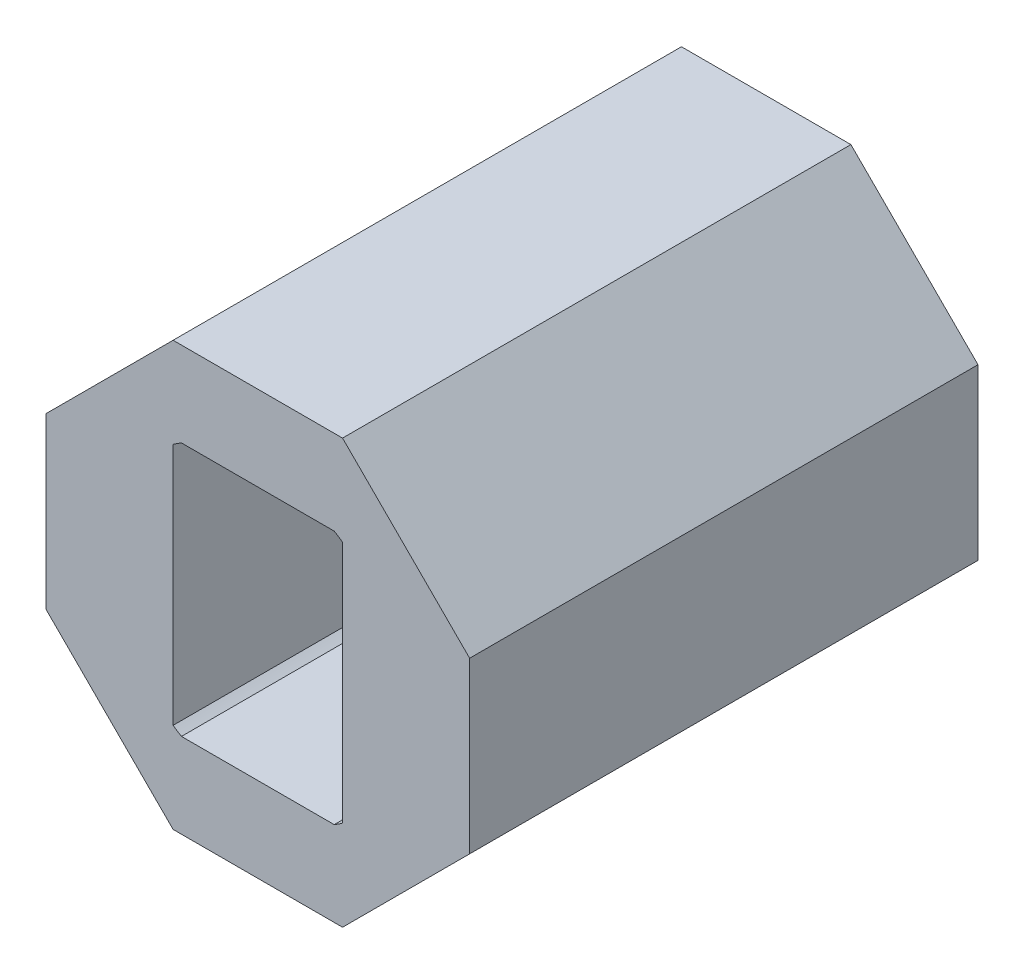
ISO-10303-21;
HEADER;
FILE_DESCRIPTION(('STEP AP214'),'2;1');
FILE_NAME('part.step','',(''),(''),'','','');
FILE_SCHEMA(('AUTOMOTIVE_DESIGN { 1 0 10303 214 1 1 1 1 }'));
ENDSEC;
DATA;
#1=APPLICATION_CONTEXT('core data for automotive mechanical design processes');
#2=APPLICATION_PROTOCOL_DEFINITION('international standard','automotive_design',2000,#1);
#3=PRODUCT_CONTEXT('',#1,'mechanical');
#4=PRODUCT('Part','Part','',(#3));
#5=PRODUCT_RELATED_PRODUCT_CATEGORY('part','',(#4));
#6=PRODUCT_DEFINITION_FORMATION('','',#4);
#7=PRODUCT_DEFINITION_CONTEXT('part definition',#1,'design');
#8=PRODUCT_DEFINITION('design','',#6,#7);
#9=PRODUCT_DEFINITION_SHAPE('','',#8);
#10=(LENGTH_UNIT() NAMED_UNIT(*) SI_UNIT(.MILLI.,.METRE.));
#11=(NAMED_UNIT(*) PLANE_ANGLE_UNIT() SI_UNIT($,.RADIAN.));
#12=(NAMED_UNIT(*) SI_UNIT($,.STERADIAN.) SOLID_ANGLE_UNIT());
#13=UNCERTAINTY_MEASURE_WITH_UNIT(LENGTH_MEASURE(1.E-05),#10,'distance_accuracy_value','');
#14=(GEOMETRIC_REPRESENTATION_CONTEXT(3) GLOBAL_UNCERTAINTY_ASSIGNED_CONTEXT((#13)) GLOBAL_UNIT_ASSIGNED_CONTEXT((#10,
#11,#12)) REPRESENTATION_CONTEXT('',''));
#15=CARTESIAN_POINT('',(0.,0.,0.));
#16=DIRECTION('',(0.,0.,1.));
#17=DIRECTION('',(1.,0.,0.));
#18=AXIS2_PLACEMENT_3D('',#15,#16,#17);
#19=CARTESIAN_POINT('',(0.,10.,12.));
#20=DIRECTION('',(0.,1.,0.));
#21=DIRECTION('',(-1.,0.,0.));
#22=AXIS2_PLACEMENT_3D('',#19,#20,#21);
#23=PLANE('',#22);
#24=DIRECTION('',(1.,0.,0.));
#25=VECTOR('',#24,1.);
#26=CARTESIAN_POINT('',(0.,10.,0.));
#27=LINE('',#26,#25);
#28=CARTESIAN_POINT('',(3.,10.,0.));
#29=VERTEX_POINT('',#28);
#30=CARTESIAN_POINT('',(7.,10.,0.));
#31=VERTEX_POINT('',#30);
#32=EDGE_CURVE('E234',#29,#31,#27,.T.);
#33=ORIENTED_EDGE('',*,*,#32,.F.);
#34=DIRECTION('',(0.,0.,-1.));
#35=VECTOR('',#34,1.);
#36=CARTESIAN_POINT('',(3.,10.,12.));
#37=LINE('',#36,#35);
#38=CARTESIAN_POINT('',(3.,10.,12.));
#39=VERTEX_POINT('',#38);
#40=EDGE_CURVE('E11',#39,#29,#37,.T.);
#41=ORIENTED_EDGE('',*,*,#40,.F.);
#42=DIRECTION('',(1.,0.,0.));
#43=VECTOR('',#42,1.);
#44=CARTESIAN_POINT('',(0.,10.,12.));
#45=LINE('',#44,#43);
#46=CARTESIAN_POINT('',(7.,10.,12.));
#47=VERTEX_POINT('',#46);
#48=EDGE_CURVE('E263',#39,#47,#45,.T.);
#49=ORIENTED_EDGE('',*,*,#48,.T.);
#50=DIRECTION('',(0.,0.,-1.));
#51=VECTOR('',#50,1.);
#52=CARTESIAN_POINT('',(7.,10.,12.));
#53=LINE('',#52,#51);
#54=EDGE_CURVE('E119',#47,#31,#53,.T.);
#55=ORIENTED_EDGE('',*,*,#54,.T.);
#56=EDGE_LOOP('',(#33,#41,#49,#55));
#57=FACE_BOUND('',#56,.T.);
#58=ADVANCED_FACE('F42',(#57),#23,.T.);
#59=CARTESIAN_POINT('',(-3.5,3.5,12.));
#60=DIRECTION('',(0.707106781186547,-0.707106781186547,0.));
#61=DIRECTION('',(0.707106781186548,0.707106781186548,0.));
#62=AXIS2_PLACEMENT_3D('',#59,#60,#61);
#63=PLANE('',#62);
#64=DIRECTION('',(-0.707106781186548,-0.707106781186548,0.));
#65=VECTOR('',#64,1.);
#66=CARTESIAN_POINT('',(-3.5,3.5,0.));
#67=LINE('',#66,#65);
#68=CARTESIAN_POINT('',(0.,7.,0.));
#69=VERTEX_POINT('',#68);
#70=EDGE_CURVE('E231',#29,#69,#67,.T.);
#71=ORIENTED_EDGE('',*,*,#70,.T.);
#72=DIRECTION('',(0.,0.,-1.));
#73=VECTOR('',#72,1.);
#74=CARTESIAN_POINT('',(0.,7.,12.));
#75=LINE('',#74,#73);
#76=CARTESIAN_POINT('',(0.,7.,12.));
#77=VERTEX_POINT('',#76);
#78=EDGE_CURVE('E52',#77,#69,#75,.T.);
#79=ORIENTED_EDGE('',*,*,#78,.F.);
#80=DIRECTION('',(-0.707106781186548,-0.707106781186548,0.));
#81=VECTOR('',#80,1.);
#82=CARTESIAN_POINT('',(-3.5,3.5,12.));
#83=LINE('',#82,#81);
#84=EDGE_CURVE('E261',#39,#77,#83,.T.);
#85=ORIENTED_EDGE('',*,*,#84,.F.);
#86=ORIENTED_EDGE('',*,*,#40,.T.);
#87=EDGE_LOOP('',(#71,#79,#85,#86));
#88=FACE_BOUND('',#87,.T.);
#89=ADVANCED_FACE('F317',(#88),#63,.F.);
#90=CARTESIAN_POINT('',(0.,0.,12.));
#91=DIRECTION('',(-1.,0.,0.));
#92=DIRECTION('',(0.,0.,1.));
#93=AXIS2_PLACEMENT_3D('',#90,#91,#92);
#94=PLANE('',#93);
#95=DIRECTION('',(0.,1.,0.));
#96=VECTOR('',#95,1.);
#97=CARTESIAN_POINT('',(0.,0.,0.));
#98=LINE('',#97,#96);
#99=CARTESIAN_POINT('',(0.,3.,0.));
#100=VERTEX_POINT('',#99);
#101=EDGE_CURVE('E228',#100,#69,#98,.T.);
#102=ORIENTED_EDGE('',*,*,#101,.F.);
#103=DIRECTION('',(0.,0.,-1.));
#104=VECTOR('',#103,1.);
#105=CARTESIAN_POINT('',(0.,3.,12.));
#106=LINE('',#105,#104);
#107=CARTESIAN_POINT('',(0.,3.,12.));
#108=VERTEX_POINT('',#107);
#109=EDGE_CURVE('E195',#108,#100,#106,.T.);
#110=ORIENTED_EDGE('',*,*,#109,.F.);
#111=DIRECTION('',(0.,1.,0.));
#112=VECTOR('',#111,1.);
#113=CARTESIAN_POINT('',(0.,0.,12.));
#114=LINE('',#113,#112);
#115=EDGE_CURVE('E258',#108,#77,#114,.T.);
#116=ORIENTED_EDGE('',*,*,#115,.T.);
#117=ORIENTED_EDGE('',*,*,#78,.T.);
#118=EDGE_LOOP('',(#102,#110,#116,#117));
#119=FACE_BOUND('',#118,.T.);
#120=ADVANCED_FACE('F322',(#119),#94,.T.);
#121=CARTESIAN_POINT('',(1.5,1.5,12.));
#122=DIRECTION('',(0.707106781186547,0.707106781186547,0.));
#123=DIRECTION('',(-0.707106781186548,0.707106781186548,0.));
#124=AXIS2_PLACEMENT_3D('',#121,#122,#123);
#125=PLANE('',#124);
#126=DIRECTION('',(0.707106781186548,-0.707106781186548,0.));
#127=VECTOR('',#126,1.);
#128=CARTESIAN_POINT('',(1.5,1.5,0.));
#129=LINE('',#128,#127);
#130=CARTESIAN_POINT('',(3.,0.,0.));
#131=VERTEX_POINT('',#130);
#132=EDGE_CURVE('E225',#100,#131,#129,.T.);
#133=ORIENTED_EDGE('',*,*,#132,.T.);
#134=DIRECTION('',(0.,0.,-1.));
#135=VECTOR('',#134,1.);
#136=CARTESIAN_POINT('',(3.,0.,12.));
#137=LINE('',#136,#135);
#138=CARTESIAN_POINT('',(3.,0.,12.));
#139=VERTEX_POINT('',#138);
#140=EDGE_CURVE('E188',#139,#131,#137,.T.);
#141=ORIENTED_EDGE('',*,*,#140,.F.);
#142=DIRECTION('',(0.707106781186548,-0.707106781186548,0.));
#143=VECTOR('',#142,1.);
#144=CARTESIAN_POINT('',(1.5,1.5,12.));
#145=LINE('',#144,#143);
#146=EDGE_CURVE('E256',#108,#139,#145,.T.);
#147=ORIENTED_EDGE('',*,*,#146,.F.);
#148=ORIENTED_EDGE('',*,*,#109,.T.);
#149=EDGE_LOOP('',(#133,#141,#147,#148));
#150=FACE_BOUND('',#149,.T.);
#151=ADVANCED_FACE('F423',(#150),#125,.F.);
#152=CARTESIAN_POINT('',(0.,0.,12.));
#153=DIRECTION('',(0.,1.,0.));
#154=DIRECTION('',(-1.,0.,0.));
#155=AXIS2_PLACEMENT_3D('',#152,#153,#154);
#156=PLANE('',#155);
#157=DIRECTION('',(1.,0.,0.));
#158=VECTOR('',#157,1.);
#159=CARTESIAN_POINT('',(0.,0.,0.));
#160=LINE('',#159,#158);
#161=CARTESIAN_POINT('',(7.,0.,0.));
#162=VERTEX_POINT('',#161);
#163=EDGE_CURVE('E222',#131,#162,#160,.T.);
#164=ORIENTED_EDGE('',*,*,#163,.T.);
#165=DIRECTION('',(0.,0.,-1.));
#166=VECTOR('',#165,1.);
#167=CARTESIAN_POINT('',(7.,0.,12.));
#168=LINE('',#167,#166);
#169=CARTESIAN_POINT('',(7.,0.,12.));
#170=VERTEX_POINT('',#169);
#171=EDGE_CURVE('E186',#170,#162,#168,.T.);
#172=ORIENTED_EDGE('',*,*,#171,.F.);
#173=DIRECTION('',(1.,0.,0.));
#174=VECTOR('',#173,1.);
#175=CARTESIAN_POINT('',(0.,0.,12.));
#176=LINE('',#175,#174);
#177=EDGE_CURVE('E179',#139,#170,#176,.T.);
#178=ORIENTED_EDGE('',*,*,#177,.F.);
#179=ORIENTED_EDGE('',*,*,#140,.T.);
#180=EDGE_LOOP('',(#164,#172,#178,#179));
#181=FACE_BOUND('',#180,.T.);
#182=ADVANCED_FACE('F420',(#181),#156,.F.);
#183=CARTESIAN_POINT('',(3.5,-3.5,12.));
#184=DIRECTION('',(-0.707106781186548,0.707106781186547,0.));
#185=DIRECTION('',(-0.707106781186547,-0.707106781186548,0.));
#186=AXIS2_PLACEMENT_3D('',#183,#184,#185);
#187=PLANE('',#186);
#188=DIRECTION('',(0.707106781186547,0.707106781186548,0.));
#189=VECTOR('',#188,1.);
#190=CARTESIAN_POINT('',(3.5,-3.5,0.));
#191=LINE('',#190,#189);
#192=CARTESIAN_POINT('',(10.,3.,0.));
#193=VERTEX_POINT('',#192);
#194=EDGE_CURVE('E185',#162,#193,#191,.T.);
#195=ORIENTED_EDGE('',*,*,#194,.T.);
#196=DIRECTION('',(0.,0.,-1.));
#197=VECTOR('',#196,1.);
#198=CARTESIAN_POINT('',(10.,3.,12.));
#199=LINE('',#198,#197);
#200=CARTESIAN_POINT('',(10.,3.,12.));
#201=VERTEX_POINT('',#200);
#202=EDGE_CURVE('E171',#201,#193,#199,.T.);
#203=ORIENTED_EDGE('',*,*,#202,.F.);
#204=DIRECTION('',(0.707106781186547,0.707106781186548,0.));
#205=VECTOR('',#204,1.);
#206=CARTESIAN_POINT('',(3.5,-3.5,12.));
#207=LINE('',#206,#205);
#208=EDGE_CURVE('E174',#170,#201,#207,.T.);
#209=ORIENTED_EDGE('',*,*,#208,.F.);
#210=ORIENTED_EDGE('',*,*,#171,.T.);
#211=EDGE_LOOP('',(#195,#203,#209,#210));
#212=FACE_BOUND('',#211,.T.);
#213=ADVANCED_FACE('F184',(#212),#187,.F.);
#214=CARTESIAN_POINT('',(10.,0.,12.));
#215=DIRECTION('',(-1.,0.,0.));
#216=DIRECTION('',(0.,0.,1.));
#217=AXIS2_PLACEMENT_3D('',#214,#215,#216);
#218=PLANE('',#217);
#219=DIRECTION('',(0.,1.,0.));
#220=VECTOR('',#219,1.);
#221=CARTESIAN_POINT('',(10.,0.,0.));
#222=LINE('',#221,#220);
#223=CARTESIAN_POINT('',(10.,7.,0.));
#224=VERTEX_POINT('',#223);
#225=EDGE_CURVE('E219',#193,#224,#222,.T.);
#226=ORIENTED_EDGE('',*,*,#225,.T.);
#227=DIRECTION('',(0.,0.,-1.));
#228=VECTOR('',#227,1.);
#229=CARTESIAN_POINT('',(10.,7.,12.));
#230=LINE('',#229,#228);
#231=CARTESIAN_POINT('',(10.,7.,12.));
#232=VERTEX_POINT('',#231);
#233=EDGE_CURVE('E173',#232,#224,#230,.T.);
#234=ORIENTED_EDGE('',*,*,#233,.F.);
#235=DIRECTION('',(0.,1.,0.));
#236=VECTOR('',#235,1.);
#237=CARTESIAN_POINT('',(10.,0.,12.));
#238=LINE('',#237,#236);
#239=EDGE_CURVE('E166',#201,#232,#238,.T.);
#240=ORIENTED_EDGE('',*,*,#239,.F.);
#241=ORIENTED_EDGE('',*,*,#202,.T.);
#242=EDGE_LOOP('',(#226,#234,#240,#241));
#243=FACE_BOUND('',#242,.T.);
#244=ADVANCED_FACE('F169',(#243),#218,.F.);
#245=CARTESIAN_POINT('',(5.,5.,12.));
#246=DIRECTION('',(0.,0.,-1.));
#247=DIRECTION('',(-1.,0.,0.));
#248=AXIS2_PLACEMENT_3D('',#245,#246,#247);
#249=CYLINDRICAL_SURFACE('',#248,3.5);
#250=CARTESIAN_POINT('',(5.,5.,0.));
#251=DIRECTION('',(0.,0.,1.));
#252=DIRECTION('',(1.,0.,0.));
#253=AXIS2_PLACEMENT_3D('',#250,#251,#252);
#254=CIRCLE('',#253,3.5);
#255=CARTESIAN_POINT('',(7.,7.87228132326902,0.));
#256=VERTEX_POINT('',#255);
#257=CARTESIAN_POINT('',(6.80277563773199,8.,0.));
#258=VERTEX_POINT('',#257);
#259=EDGE_CURVE('E251',#256,#258,#254,.T.);
#260=ORIENTED_EDGE('',*,*,#259,.F.);
#261=DIRECTION('',(0.,0.,-1.));
#262=VECTOR('',#261,1.);
#263=CARTESIAN_POINT('',(7.,7.87228132326902,12.));
#264=LINE('',#263,#262);
#265=CARTESIAN_POINT('',(7.,7.87228132326902,12.));
#266=VERTEX_POINT('',#265);
#267=EDGE_CURVE('E46',#266,#256,#264,.T.);
#268=ORIENTED_EDGE('',*,*,#267,.F.);
#269=CARTESIAN_POINT('',(5.,5.,12.));
#270=DIRECTION('',(0.,0.,1.));
#271=DIRECTION('',(1.,0.,0.));
#272=AXIS2_PLACEMENT_3D('',#269,#270,#271);
#273=CIRCLE('',#272,3.5);
#274=CARTESIAN_POINT('',(6.80277563773199,8.,12.));
#275=VERTEX_POINT('',#274);
#276=EDGE_CURVE('E218',#266,#275,#273,.T.);
#277=ORIENTED_EDGE('',*,*,#276,.T.);
#278=DIRECTION('',(0.,0.,-1.));
#279=VECTOR('',#278,1.);
#280=CARTESIAN_POINT('',(6.80277563773199,8.,12.));
#281=LINE('',#280,#279);
#282=EDGE_CURVE('E198',#275,#258,#281,.T.);
#283=ORIENTED_EDGE('',*,*,#282,.T.);
#284=EDGE_LOOP('',(#260,#268,#277,#283));
#285=FACE_BOUND('',#284,.T.);
#286=ADVANCED_FACE('F314',(#285),#249,.F.);
#287=CARTESIAN_POINT('',(7.,0.,12.));
#288=DIRECTION('',(-1.,0.,0.));
#289=DIRECTION('',(0.,0.,1.));
#290=AXIS2_PLACEMENT_3D('',#287,#288,#289);
#291=PLANE('',#290);
#292=DIRECTION('',(0.,1.,0.));
#293=VECTOR('',#292,1.);
#294=CARTESIAN_POINT('',(7.,0.,0.));
#295=LINE('',#294,#293);
#296=CARTESIAN_POINT('',(7.,2.12771867673099,0.));
#297=VERTEX_POINT('',#296);
#298=EDGE_CURVE('E248',#297,#256,#295,.T.);
#299=ORIENTED_EDGE('',*,*,#298,.F.);
#300=DIRECTION('',(0.,0.,-1.));
#301=VECTOR('',#300,1.);
#302=CARTESIAN_POINT('',(7.,2.12771867673099,12.));
#303=LINE('',#302,#301);
#304=CARTESIAN_POINT('',(7.,2.12771867673099,12.));
#305=VERTEX_POINT('',#304);
#306=EDGE_CURVE('E209',#305,#297,#303,.T.);
#307=ORIENTED_EDGE('',*,*,#306,.F.);
#308=DIRECTION('',(0.,1.,0.));
#309=VECTOR('',#308,1.);
#310=CARTESIAN_POINT('',(7.,0.,12.));
#311=LINE('',#310,#309);
#312=EDGE_CURVE('E275',#305,#266,#311,.T.);
#313=ORIENTED_EDGE('',*,*,#312,.T.);
#314=ORIENTED_EDGE('',*,*,#267,.T.);
#315=EDGE_LOOP('',(#299,#307,#313,#314));
#316=FACE_BOUND('',#315,.T.);
#317=ADVANCED_FACE('F44',(#316),#291,.T.);
#318=CARTESIAN_POINT('',(6.80277563773199,2.,0.));
#319=VERTEX_POINT('',#318);
#320=EDGE_CURVE('E247',#319,#297,#254,.T.);
#321=ORIENTED_EDGE('',*,*,#320,.F.);
#322=DIRECTION('',(0.,0.,-1.));
#323=VECTOR('',#322,1.);
#324=CARTESIAN_POINT('',(6.80277563773199,2.,12.));
#325=LINE('',#324,#323);
#326=CARTESIAN_POINT('',(6.80277563773199,2.,12.));
#327=VERTEX_POINT('',#326);
#328=EDGE_CURVE('E208',#327,#319,#325,.T.);
#329=ORIENTED_EDGE('',*,*,#328,.F.);
#330=EDGE_CURVE('E274',#327,#305,#273,.T.);
#331=ORIENTED_EDGE('',*,*,#330,.T.);
#332=ORIENTED_EDGE('',*,*,#306,.T.);
#333=EDGE_LOOP('',(#321,#329,#331,#332));
#334=FACE_BOUND('',#333,.T.);
#335=ADVANCED_FACE('F315',(#334),#249,.F.);
#336=CARTESIAN_POINT('',(0.,2.,12.));
#337=DIRECTION('',(0.,1.,0.));
#338=DIRECTION('',(-1.,0.,0.));
#339=AXIS2_PLACEMENT_3D('',#336,#337,#338);
#340=PLANE('',#339);
#341=DIRECTION('',(1.,0.,0.));
#342=VECTOR('',#341,1.);
#343=CARTESIAN_POINT('',(0.,2.,0.));
#344=LINE('',#343,#342);
#345=CARTESIAN_POINT('',(3.19722436226801,2.,0.));
#346=VERTEX_POINT('',#345);
#347=EDGE_CURVE('E244',#346,#319,#344,.T.);
#348=ORIENTED_EDGE('',*,*,#347,.F.);
#349=DIRECTION('',(0.,0.,-1.));
#350=VECTOR('',#349,1.);
#351=CARTESIAN_POINT('',(3.19722436226801,2.,12.));
#352=LINE('',#351,#350);
#353=CARTESIAN_POINT('',(3.19722436226801,2.,12.));
#354=VERTEX_POINT('',#353);
#355=EDGE_CURVE('E206',#354,#346,#352,.T.);
#356=ORIENTED_EDGE('',*,*,#355,.F.);
#357=DIRECTION('',(1.,0.,0.));
#358=VECTOR('',#357,1.);
#359=CARTESIAN_POINT('',(0.,2.,12.));
#360=LINE('',#359,#358);
#361=EDGE_CURVE('E271',#354,#327,#360,.T.);
#362=ORIENTED_EDGE('',*,*,#361,.T.);
#363=ORIENTED_EDGE('',*,*,#328,.T.);
#364=EDGE_LOOP('',(#348,#356,#362,#363));
#365=FACE_BOUND('',#364,.T.);
#366=ADVANCED_FACE('F292',(#365),#340,.T.);
#367=CARTESIAN_POINT('',(3.,2.12771867673099,0.));
#368=VERTEX_POINT('',#367);
#369=EDGE_CURVE('E243',#368,#346,#254,.T.);
#370=ORIENTED_EDGE('',*,*,#369,.F.);
#371=DIRECTION('',(0.,0.,-1.));
#372=VECTOR('',#371,1.);
#373=CARTESIAN_POINT('',(3.,2.12771867673099,12.));
#374=LINE('',#373,#372);
#375=CARTESIAN_POINT('',(3.,2.12771867673099,12.));
#376=VERTEX_POINT('',#375);
#377=EDGE_CURVE('E204',#376,#368,#374,.T.);
#378=ORIENTED_EDGE('',*,*,#377,.F.);
#379=EDGE_CURVE('E270',#376,#354,#273,.T.);
#380=ORIENTED_EDGE('',*,*,#379,.T.);
#381=ORIENTED_EDGE('',*,*,#355,.T.);
#382=EDGE_LOOP('',(#370,#378,#380,#381));
#383=FACE_BOUND('',#382,.T.);
#384=ADVANCED_FACE('F283',(#383),#249,.F.);
#385=CARTESIAN_POINT('',(3.,0.,12.));
#386=DIRECTION('',(-1.,0.,0.));
#387=DIRECTION('',(0.,0.,1.));
#388=AXIS2_PLACEMENT_3D('',#385,#386,#387);
#389=PLANE('',#388);
#390=DIRECTION('',(0.,1.,0.));
#391=VECTOR('',#390,1.);
#392=CARTESIAN_POINT('',(3.,0.,0.));
#393=LINE('',#392,#391);
#394=CARTESIAN_POINT('',(3.,7.87228132326902,0.));
#395=VERTEX_POINT('',#394);
#396=EDGE_CURVE('E240',#368,#395,#393,.T.);
#397=ORIENTED_EDGE('',*,*,#396,.T.);
#398=DIRECTION('',(0.,0.,-1.));
#399=VECTOR('',#398,1.);
#400=CARTESIAN_POINT('',(3.,7.87228132326902,12.));
#401=LINE('',#400,#399);
#402=CARTESIAN_POINT('',(3.,7.87228132326902,12.));
#403=VERTEX_POINT('',#402);
#404=EDGE_CURVE('E202',#403,#395,#401,.T.);
#405=ORIENTED_EDGE('',*,*,#404,.F.);
#406=DIRECTION('',(0.,1.,0.));
#407=VECTOR('',#406,1.);
#408=CARTESIAN_POINT('',(3.,0.,12.));
#409=LINE('',#408,#407);
#410=EDGE_CURVE('E268',#376,#403,#409,.T.);
#411=ORIENTED_EDGE('',*,*,#410,.F.);
#412=ORIENTED_EDGE('',*,*,#377,.T.);
#413=EDGE_LOOP('',(#397,#405,#411,#412));
#414=FACE_BOUND('',#413,.T.);
#415=ADVANCED_FACE('F305',(#414),#389,.F.);
#416=CARTESIAN_POINT('',(3.197224362268,8.,0.));
#417=VERTEX_POINT('',#416);
#418=EDGE_CURVE('E239',#417,#395,#254,.T.);
#419=ORIENTED_EDGE('',*,*,#418,.F.);
#420=DIRECTION('',(0.,0.,-1.));
#421=VECTOR('',#420,1.);
#422=CARTESIAN_POINT('',(3.197224362268,8.,12.));
#423=LINE('',#422,#421);
#424=CARTESIAN_POINT('',(3.197224362268,8.,12.));
#425=VERTEX_POINT('',#424);
#426=EDGE_CURVE('E200',#425,#417,#423,.T.);
#427=ORIENTED_EDGE('',*,*,#426,.F.);
#428=EDGE_CURVE('E267',#425,#403,#273,.T.);
#429=ORIENTED_EDGE('',*,*,#428,.T.);
#430=ORIENTED_EDGE('',*,*,#404,.T.);
#431=EDGE_LOOP('',(#419,#427,#429,#430));
#432=FACE_BOUND('',#431,.T.);
#433=ADVANCED_FACE('F302',(#432),#249,.F.);
#434=CARTESIAN_POINT('',(0.,8.,12.));
#435=DIRECTION('',(0.,1.,0.));
#436=DIRECTION('',(0.,0.,1.));
#437=AXIS2_PLACEMENT_3D('',#434,#435,#436);
#438=PLANE('',#437);
#439=DIRECTION('',(1.,0.,0.));
#440=VECTOR('',#439,1.);
#441=CARTESIAN_POINT('',(0.,8.,0.));
#442=LINE('',#441,#440);
#443=EDGE_CURVE('E236',#417,#258,#442,.T.);
#444=ORIENTED_EDGE('',*,*,#443,.T.);
#445=ORIENTED_EDGE('',*,*,#282,.F.);
#446=DIRECTION('',(1.,0.,0.));
#447=VECTOR('',#446,1.);
#448=CARTESIAN_POINT('',(0.,8.,12.));
#449=LINE('',#448,#447);
#450=EDGE_CURVE('E265',#425,#275,#449,.T.);
#451=ORIENTED_EDGE('',*,*,#450,.F.);
#452=ORIENTED_EDGE('',*,*,#426,.T.);
#453=EDGE_LOOP('',(#444,#445,#451,#452));
#454=FACE_BOUND('',#453,.T.);
#455=ADVANCED_FACE('F312',(#454),#438,.F.);
#456=CARTESIAN_POINT('',(8.5,8.5,12.));
#457=DIRECTION('',(-0.707106781186547,-0.707106781186547,0.));
#458=DIRECTION('',(0.707106781186548,-0.707106781186548,0.));
#459=AXIS2_PLACEMENT_3D('',#456,#457,#458);
#460=PLANE('',#459);
#461=DIRECTION('',(-0.707106781186548,0.707106781186548,0.));
#462=VECTOR('',#461,1.);
#463=CARTESIAN_POINT('',(8.5,8.5,0.));
#464=LINE('',#463,#462);
#465=EDGE_CURVE('E112',#224,#31,#464,.T.);
#466=ORIENTED_EDGE('',*,*,#465,.T.);
#467=ORIENTED_EDGE('',*,*,#54,.F.);
#468=DIRECTION('',(-0.707106781186548,0.707106781186548,0.));
#469=VECTOR('',#468,1.);
#470=CARTESIAN_POINT('',(8.5,8.5,12.));
#471=LINE('',#470,#469);
#472=EDGE_CURVE('E61',#232,#47,#471,.T.);
#473=ORIENTED_EDGE('',*,*,#472,.F.);
#474=ORIENTED_EDGE('',*,*,#233,.T.);
#475=EDGE_LOOP('',(#466,#467,#473,#474));
#476=FACE_BOUND('',#475,.T.);
#477=ADVANCED_FACE('F328',(#476),#460,.F.);
#478=CARTESIAN_POINT('',(0.,0.,12.));
#479=DIRECTION('',(0.,0.,1.));
#480=DIRECTION('',(1.,0.,0.));
#481=AXIS2_PLACEMENT_3D('',#478,#479,#480);
#482=PLANE('',#481);
#483=ORIENTED_EDGE('',*,*,#276,.F.);
#484=ORIENTED_EDGE('',*,*,#312,.F.);
#485=ORIENTED_EDGE('',*,*,#330,.F.);
#486=ORIENTED_EDGE('',*,*,#361,.F.);
#487=ORIENTED_EDGE('',*,*,#379,.F.);
#488=ORIENTED_EDGE('',*,*,#410,.T.);
#489=ORIENTED_EDGE('',*,*,#428,.F.);
#490=ORIENTED_EDGE('',*,*,#450,.T.);
#491=EDGE_LOOP('',(#483,#484,#485,#486,#487,#488,#489,#490));
#492=FACE_BOUND('',#491,.T.);
#493=ORIENTED_EDGE('',*,*,#48,.F.);
#494=ORIENTED_EDGE('',*,*,#84,.T.);
#495=ORIENTED_EDGE('',*,*,#115,.F.);
#496=ORIENTED_EDGE('',*,*,#146,.T.);
#497=ORIENTED_EDGE('',*,*,#177,.T.);
#498=ORIENTED_EDGE('',*,*,#208,.T.);
#499=ORIENTED_EDGE('',*,*,#239,.T.);
#500=ORIENTED_EDGE('',*,*,#472,.T.);
#501=EDGE_LOOP('',(#493,#494,#495,#496,#497,#498,#499,#500));
#502=FACE_BOUND('',#501,.T.);
#503=ADVANCED_FACE('F177',(#492,#502),#482,.T.);
#504=CARTESIAN_POINT('',(0.,0.,0.));
#505=DIRECTION('',(0.,0.,1.));
#506=DIRECTION('',(1.,0.,0.));
#507=AXIS2_PLACEMENT_3D('',#504,#505,#506);
#508=PLANE('',#507);
#509=ORIENTED_EDGE('',*,*,#259,.T.);
#510=ORIENTED_EDGE('',*,*,#443,.F.);
#511=ORIENTED_EDGE('',*,*,#418,.T.);
#512=ORIENTED_EDGE('',*,*,#396,.F.);
#513=ORIENTED_EDGE('',*,*,#369,.T.);
#514=ORIENTED_EDGE('',*,*,#347,.T.);
#515=ORIENTED_EDGE('',*,*,#320,.T.);
#516=ORIENTED_EDGE('',*,*,#298,.T.);
#517=EDGE_LOOP('',(#509,#510,#511,#512,#513,#514,#515,#516));
#518=FACE_BOUND('',#517,.T.);
#519=ORIENTED_EDGE('',*,*,#32,.T.);
#520=ORIENTED_EDGE('',*,*,#465,.F.);
#521=ORIENTED_EDGE('',*,*,#225,.F.);
#522=ORIENTED_EDGE('',*,*,#194,.F.);
#523=ORIENTED_EDGE('',*,*,#163,.F.);
#524=ORIENTED_EDGE('',*,*,#132,.F.);
#525=ORIENTED_EDGE('',*,*,#101,.T.);
#526=ORIENTED_EDGE('',*,*,#70,.F.);
#527=EDGE_LOOP('',(#519,#520,#521,#522,#523,#524,#525,#526));
#528=FACE_BOUND('',#527,.T.);
#529=ADVANCED_FACE('F297',(#518,#528),#508,.F.);
#530=CLOSED_SHELL('',(#58,#89,#120,#151,#182,#213,#244,#286,#317,#335,#366,#384,#415,#433,#455,
#477,#503,#529));
#531=MANIFOLD_SOLID_BREP('B2',#530);
#532=ADVANCED_BREP_SHAPE_REPRESENTATION('',(#18,#531),#14);
#533=SHAPE_DEFINITION_REPRESENTATION(#9,#532);
ENDSEC;
END-ISO-10303-21;
